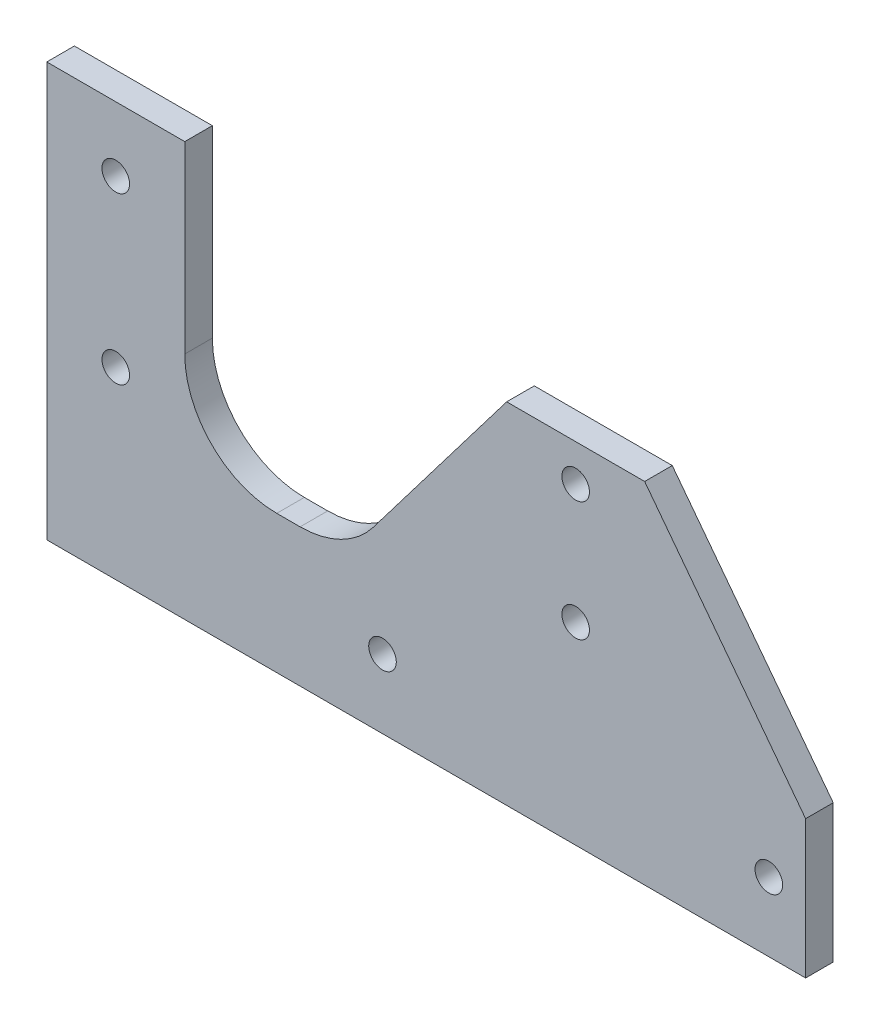
ISO-10303-21;
HEADER;
FILE_DESCRIPTION(('STEP AP214'),'2;1');
FILE_NAME('part.step','',(''),(''),'','','');
FILE_SCHEMA(('AUTOMOTIVE_DESIGN { 1 0 10303 214 1 1 1 1 }'));
ENDSEC;
DATA;
#1=APPLICATION_CONTEXT('core data for automotive mechanical design processes');
#2=APPLICATION_PROTOCOL_DEFINITION('international standard','automotive_design',2000,#1);
#3=PRODUCT_CONTEXT('',#1,'mechanical');
#4=PRODUCT('Part','Part','',(#3));
#5=PRODUCT_RELATED_PRODUCT_CATEGORY('part','',(#4));
#6=PRODUCT_DEFINITION_FORMATION('','',#4);
#7=PRODUCT_DEFINITION_CONTEXT('part definition',#1,'design');
#8=PRODUCT_DEFINITION('design','',#6,#7);
#9=PRODUCT_DEFINITION_SHAPE('','',#8);
#10=(LENGTH_UNIT() NAMED_UNIT(*) SI_UNIT(.MILLI.,.METRE.));
#11=(NAMED_UNIT(*) PLANE_ANGLE_UNIT() SI_UNIT($,.RADIAN.));
#12=(NAMED_UNIT(*) SI_UNIT($,.STERADIAN.) SOLID_ANGLE_UNIT());
#13=UNCERTAINTY_MEASURE_WITH_UNIT(LENGTH_MEASURE(1.E-05),#10,'distance_accuracy_value','');
#14=(GEOMETRIC_REPRESENTATION_CONTEXT(3) GLOBAL_UNCERTAINTY_ASSIGNED_CONTEXT((#13)) GLOBAL_UNIT_ASSIGNED_CONTEXT((#10,
#11,#12)) REPRESENTATION_CONTEXT('',''));
#15=CARTESIAN_POINT('',(0.,0.,0.));
#16=DIRECTION('',(0.,0.,1.));
#17=DIRECTION('',(1.,0.,0.));
#18=AXIS2_PLACEMENT_3D('',#15,#16,#17);
#19=CARTESIAN_POINT('',(-57.5,6.99999999999999,3.));
#20=DIRECTION('',(1.,0.,0.));
#21=DIRECTION('',(0.,1.,0.));
#22=AXIS2_PLACEMENT_3D('',#19,#20,#21);
#23=PLANE('',#22);
#24=DIRECTION('',(0.,-1.,0.));
#25=VECTOR('',#24,1.);
#26=CARTESIAN_POINT('',(-57.5,6.99999999999999,0.));
#27=LINE('',#26,#25);
#28=CARTESIAN_POINT('',(-57.5,6.99999999999999,0.));
#29=VERTEX_POINT('',#28);
#30=CARTESIAN_POINT('',(-57.5,-38.,0.));
#31=VERTEX_POINT('',#30);
#32=EDGE_CURVE('E151',#29,#31,#27,.T.);
#33=ORIENTED_EDGE('',*,*,#32,.T.);
#34=DIRECTION('',(0.,0.,-1.));
#35=VECTOR('',#34,1.);
#36=CARTESIAN_POINT('',(-57.5,-38.,3.));
#37=LINE('',#36,#35);
#38=CARTESIAN_POINT('',(-57.5,-38.,3.));
#39=VERTEX_POINT('',#38);
#40=EDGE_CURVE('E11',#39,#31,#37,.T.);
#41=ORIENTED_EDGE('',*,*,#40,.F.);
#42=DIRECTION('',(0.,-1.,0.));
#43=VECTOR('',#42,1.);
#44=CARTESIAN_POINT('',(-57.5,6.99999999999999,3.));
#45=LINE('',#44,#43);
#46=CARTESIAN_POINT('',(-57.5,6.99999999999999,3.));
#47=VERTEX_POINT('',#46);
#48=EDGE_CURVE('E172',#47,#39,#45,.T.);
#49=ORIENTED_EDGE('',*,*,#48,.F.);
#50=DIRECTION('',(0.,0.,-1.));
#51=VECTOR('',#50,1.);
#52=CARTESIAN_POINT('',(-57.5,6.99999999999999,3.));
#53=LINE('',#52,#51);
#54=EDGE_CURVE('E147',#47,#29,#53,.T.);
#55=ORIENTED_EDGE('',*,*,#54,.T.);
#56=EDGE_LOOP('',(#33,#41,#49,#55));
#57=FACE_BOUND('',#56,.T.);
#58=ADVANCED_FACE('F37',(#57),#23,.F.);
#59=CARTESIAN_POINT('',(25.,-38.,3.));
#60=DIRECTION('',(0.,1.,0.));
#61=DIRECTION('',(0.,0.,1.));
#62=AXIS2_PLACEMENT_3D('',#59,#60,#61);
#63=PLANE('',#62);
#64=DIRECTION('',(1.,0.,0.));
#65=VECTOR('',#64,1.);
#66=CARTESIAN_POINT('',(25.,-38.,0.));
#67=LINE('',#66,#65);
#68=CARTESIAN_POINT('',(25.,-38.,0.));
#69=VERTEX_POINT('',#68);
#70=EDGE_CURVE('E154',#31,#69,#67,.T.);
#71=ORIENTED_EDGE('',*,*,#70,.T.);
#72=DIRECTION('',(0.,0.,-1.));
#73=VECTOR('',#72,1.);
#74=CARTESIAN_POINT('',(25.,-38.,3.));
#75=LINE('',#74,#73);
#76=CARTESIAN_POINT('',(25.,-38.,3.));
#77=VERTEX_POINT('',#76);
#78=EDGE_CURVE('E45',#77,#69,#75,.T.);
#79=ORIENTED_EDGE('',*,*,#78,.F.);
#80=DIRECTION('',(1.,0.,0.));
#81=VECTOR('',#80,1.);
#82=CARTESIAN_POINT('',(-57.5,-38.,3.));
#83=LINE('',#82,#81);
#84=EDGE_CURVE('E105',#39,#77,#83,.T.);
#85=ORIENTED_EDGE('',*,*,#84,.F.);
#86=ORIENTED_EDGE('',*,*,#40,.T.);
#87=EDGE_LOOP('',(#71,#79,#85,#86));
#88=FACE_BOUND('',#87,.T.);
#89=ADVANCED_FACE('F245',(#88),#63,.F.);
#90=CARTESIAN_POINT('',(25.,-23.,3.));
#91=DIRECTION('',(-1.,0.,0.));
#92=DIRECTION('',(0.,0.,1.));
#93=AXIS2_PLACEMENT_3D('',#90,#91,#92);
#94=PLANE('',#93);
#95=DIRECTION('',(0.,1.,0.));
#96=VECTOR('',#95,1.);
#97=CARTESIAN_POINT('',(25.,-23.,0.));
#98=LINE('',#97,#96);
#99=CARTESIAN_POINT('',(25.,-23.,0.));
#100=VERTEX_POINT('',#99);
#101=EDGE_CURVE('E157',#69,#100,#98,.T.);
#102=ORIENTED_EDGE('',*,*,#101,.T.);
#103=DIRECTION('',(0.,0.,-1.));
#104=VECTOR('',#103,1.);
#105=CARTESIAN_POINT('',(25.,-23.,3.));
#106=LINE('',#105,#104);
#107=CARTESIAN_POINT('',(25.,-23.,3.));
#108=VERTEX_POINT('',#107);
#109=EDGE_CURVE('E188',#108,#100,#106,.T.);
#110=ORIENTED_EDGE('',*,*,#109,.F.);
#111=DIRECTION('',(0.,1.,0.));
#112=VECTOR('',#111,1.);
#113=CARTESIAN_POINT('',(25.,-23.,3.));
#114=LINE('',#113,#112);
#115=EDGE_CURVE('E196',#77,#108,#114,.T.);
#116=ORIENTED_EDGE('',*,*,#115,.F.);
#117=ORIENTED_EDGE('',*,*,#78,.T.);
#118=EDGE_LOOP('',(#102,#110,#116,#117));
#119=FACE_BOUND('',#118,.T.);
#120=ADVANCED_FACE('F194',(#119),#94,.F.);
#121=CARTESIAN_POINT('',(7.5,0.,3.));
#122=DIRECTION('',(-0.795828694120859,-0.605521832483262,0.));
#123=DIRECTION('',(0.605521832483262,-0.795828694120859,0.));
#124=AXIS2_PLACEMENT_3D('',#121,#122,#123);
#125=PLANE('',#124);
#126=DIRECTION('',(-0.605521832483262,0.795828694120859,0.));
#127=VECTOR('',#126,1.);
#128=CARTESIAN_POINT('',(7.5,0.,0.));
#129=LINE('',#128,#127);
#130=CARTESIAN_POINT('',(7.5,0.,0.));
#131=VERTEX_POINT('',#130);
#132=EDGE_CURVE('E159',#100,#131,#129,.T.);
#133=ORIENTED_EDGE('',*,*,#132,.T.);
#134=DIRECTION('',(0.,0.,-1.));
#135=VECTOR('',#134,1.);
#136=CARTESIAN_POINT('',(7.5,0.,3.));
#137=LINE('',#136,#135);
#138=CARTESIAN_POINT('',(7.5,0.,3.));
#139=VERTEX_POINT('',#138);
#140=EDGE_CURVE('E185',#139,#131,#137,.T.);
#141=ORIENTED_EDGE('',*,*,#140,.F.);
#142=DIRECTION('',(-0.605521832483262,0.795828694120859,0.));
#143=VECTOR('',#142,1.);
#144=CARTESIAN_POINT('',(7.5,0.,3.));
#145=LINE('',#144,#143);
#146=EDGE_CURVE('E214',#108,#139,#145,.T.);
#147=ORIENTED_EDGE('',*,*,#146,.F.);
#148=ORIENTED_EDGE('',*,*,#109,.T.);
#149=EDGE_LOOP('',(#133,#141,#147,#148));
#150=FACE_BOUND('',#149,.T.);
#151=ADVANCED_FACE('F205',(#150),#125,.F.);
#152=CARTESIAN_POINT('',(-7.5,0.,3.));
#153=DIRECTION('',(0.,-1.,0.));
#154=DIRECTION('',(0.,0.,-1.));
#155=AXIS2_PLACEMENT_3D('',#152,#153,#154);
#156=PLANE('',#155);
#157=DIRECTION('',(-1.,0.,0.));
#158=VECTOR('',#157,1.);
#159=CARTESIAN_POINT('',(-7.5,0.,0.));
#160=LINE('',#159,#158);
#161=CARTESIAN_POINT('',(-7.5,0.,0.));
#162=VERTEX_POINT('',#161);
#163=EDGE_CURVE('E161',#131,#162,#160,.T.);
#164=ORIENTED_EDGE('',*,*,#163,.T.);
#165=DIRECTION('',(0.,0.,-1.));
#166=VECTOR('',#165,1.);
#167=CARTESIAN_POINT('',(-7.5,0.,3.));
#168=LINE('',#167,#166);
#169=CARTESIAN_POINT('',(-7.5,0.,3.));
#170=VERTEX_POINT('',#169);
#171=EDGE_CURVE('E182',#170,#162,#168,.T.);
#172=ORIENTED_EDGE('',*,*,#171,.F.);
#173=DIRECTION('',(-1.,0.,0.));
#174=VECTOR('',#173,1.);
#175=CARTESIAN_POINT('',(-7.5,0.,3.));
#176=LINE('',#175,#174);
#177=EDGE_CURVE('E211',#139,#170,#176,.T.);
#178=ORIENTED_EDGE('',*,*,#177,.F.);
#179=ORIENTED_EDGE('',*,*,#140,.T.);
#180=EDGE_LOOP('',(#164,#172,#178,#179));
#181=FACE_BOUND('',#180,.T.);
#182=ADVANCED_FACE('F209',(#181),#156,.F.);
#183=CARTESIAN_POINT('',(-7.5,0.,3.));
#184=DIRECTION('',(0.795828694120859,-0.605521832483262,0.));
#185=DIRECTION('',(0.605521832483262,0.795828694120859,0.));
#186=AXIS2_PLACEMENT_3D('',#183,#184,#185);
#187=PLANE('',#186);
#188=DIRECTION('',(-0.605521832483262,-0.795828694120859,0.));
#189=VECTOR('',#188,1.);
#190=CARTESIAN_POINT('',(-7.5,0.,0.));
#191=LINE('',#190,#189);
#192=CARTESIAN_POINT('',(-21.9985356819378,-19.0552183248326,0.));
#193=VERTEX_POINT('',#192);
#194=EDGE_CURVE('E163',#162,#193,#191,.T.);
#195=ORIENTED_EDGE('',*,*,#194,.T.);
#196=DIRECTION('',(0.,0.,-1.));
#197=VECTOR('',#196,1.);
#198=CARTESIAN_POINT('',(-21.9985356819378,-19.0552183248326,3.));
#199=LINE('',#198,#197);
#200=CARTESIAN_POINT('',(-21.9985356819378,-19.0552183248326,3.));
#201=VERTEX_POINT('',#200);
#202=EDGE_CURVE('E179',#201,#193,#199,.T.);
#203=ORIENTED_EDGE('',*,*,#202,.F.);
#204=DIRECTION('',(-0.605521832483262,-0.795828694120859,0.));
#205=VECTOR('',#204,1.);
#206=CARTESIAN_POINT('',(-7.5,0.,3.));
#207=LINE('',#206,#205);
#208=EDGE_CURVE('E213',#170,#201,#207,.T.);
#209=ORIENTED_EDGE('',*,*,#208,.F.);
#210=ORIENTED_EDGE('',*,*,#171,.T.);
#211=EDGE_LOOP('',(#195,#203,#209,#210));
#212=FACE_BOUND('',#211,.T.);
#213=ADVANCED_FACE('F258',(#212),#187,.F.);
#214=CARTESIAN_POINT('',(-29.9568226231465,-13.,3.));
#215=DIRECTION('',(0.,0.,-1.));
#216=DIRECTION('',(-1.,0.,0.));
#217=AXIS2_PLACEMENT_3D('',#214,#215,#216);
#218=CYLINDRICAL_SURFACE('',#217,10.);
#219=CARTESIAN_POINT('',(-29.9568226231465,-13.,0.));
#220=DIRECTION('',(0.,0.,-1.));
#221=DIRECTION('',(1.,0.,0.));
#222=AXIS2_PLACEMENT_3D('',#219,#220,#221);
#223=CIRCLE('',#222,10.);
#224=CARTESIAN_POINT('',(-29.9568226231465,-23.,0.));
#225=VERTEX_POINT('',#224);
#226=EDGE_CURVE('E165',#193,#225,#223,.T.);
#227=ORIENTED_EDGE('',*,*,#226,.T.);
#228=DIRECTION('',(0.,0.,-1.));
#229=VECTOR('',#228,1.);
#230=CARTESIAN_POINT('',(-29.9568226231465,-23.,3.));
#231=LINE('',#230,#229);
#232=CARTESIAN_POINT('',(-29.9568226231465,-23.,3.));
#233=VERTEX_POINT('',#232);
#234=EDGE_CURVE('E176',#233,#225,#231,.T.);
#235=ORIENTED_EDGE('',*,*,#234,.F.);
#236=CARTESIAN_POINT('',(-29.9568226231465,-13.,3.));
#237=DIRECTION('',(0.,0.,-1.));
#238=DIRECTION('',(1.,0.,0.));
#239=AXIS2_PLACEMENT_3D('',#236,#237,#238);
#240=CIRCLE('',#239,10.);
#241=EDGE_CURVE('E216',#201,#233,#240,.T.);
#242=ORIENTED_EDGE('',*,*,#241,.F.);
#243=ORIENTED_EDGE('',*,*,#202,.T.);
#244=EDGE_LOOP('',(#227,#235,#242,#243));
#245=FACE_BOUND('',#244,.T.);
#246=ADVANCED_FACE('F225',(#245),#218,.F.);
#247=CARTESIAN_POINT('',(-29.9568226231465,-23.,3.));
#248=DIRECTION('',(0.,-1.,0.));
#249=DIRECTION('',(0.,0.,-1.));
#250=AXIS2_PLACEMENT_3D('',#247,#248,#249);
#251=PLANE('',#250);
#252=DIRECTION('',(-1.,0.,0.));
#253=VECTOR('',#252,1.);
#254=CARTESIAN_POINT('',(-29.9568226231465,-23.,0.));
#255=LINE('',#254,#253);
#256=CARTESIAN_POINT('',(-32.4999999999999,-23.,0.));
#257=VERTEX_POINT('',#256);
#258=EDGE_CURVE('E167',#225,#257,#255,.T.);
#259=ORIENTED_EDGE('',*,*,#258,.T.);
#260=DIRECTION('',(0.,0.,-1.));
#261=VECTOR('',#260,1.);
#262=CARTESIAN_POINT('',(-32.4999999999999,-23.,3.));
#263=LINE('',#262,#261);
#264=CARTESIAN_POINT('',(-32.4999999999999,-23.,3.));
#265=VERTEX_POINT('',#264);
#266=EDGE_CURVE('E142',#265,#257,#263,.T.);
#267=ORIENTED_EDGE('',*,*,#266,.F.);
#268=DIRECTION('',(-1.,0.,0.));
#269=VECTOR('',#268,1.);
#270=CARTESIAN_POINT('',(-29.9568226231465,-23.,3.));
#271=LINE('',#270,#269);
#272=EDGE_CURVE('E133',#233,#265,#271,.T.);
#273=ORIENTED_EDGE('',*,*,#272,.F.);
#274=ORIENTED_EDGE('',*,*,#234,.T.);
#275=EDGE_LOOP('',(#259,#267,#273,#274));
#276=FACE_BOUND('',#275,.T.);
#277=ADVANCED_FACE('F229',(#276),#251,.F.);
#278=CARTESIAN_POINT('',(-32.5,-13.,3.));
#279=DIRECTION('',(0.,0.,-1.));
#280=DIRECTION('',(-1.,0.,0.));
#281=AXIS2_PLACEMENT_3D('',#278,#279,#280);
#282=CYLINDRICAL_SURFACE('',#281,10.);
#283=CARTESIAN_POINT('',(-32.5,-13.,0.));
#284=DIRECTION('',(0.,0.,-1.));
#285=DIRECTION('',(-1.,0.,0.));
#286=AXIS2_PLACEMENT_3D('',#283,#284,#285);
#287=CIRCLE('',#286,10.);
#288=CARTESIAN_POINT('',(-42.5,-12.9999999999999,0.));
#289=VERTEX_POINT('',#288);
#290=EDGE_CURVE('E141',#257,#289,#287,.T.);
#291=ORIENTED_EDGE('',*,*,#290,.T.);
#292=DIRECTION('',(0.,0.,-1.));
#293=VECTOR('',#292,1.);
#294=CARTESIAN_POINT('',(-42.5,-12.9999999999999,3.));
#295=LINE('',#294,#293);
#296=CARTESIAN_POINT('',(-42.5,-12.9999999999999,3.));
#297=VERTEX_POINT('',#296);
#298=EDGE_CURVE('E138',#297,#289,#295,.T.);
#299=ORIENTED_EDGE('',*,*,#298,.F.);
#300=CARTESIAN_POINT('',(-32.5,-13.,3.));
#301=DIRECTION('',(0.,0.,-1.));
#302=DIRECTION('',(-1.,0.,0.));
#303=AXIS2_PLACEMENT_3D('',#300,#301,#302);
#304=CIRCLE('',#303,10.);
#305=EDGE_CURVE('E127',#265,#297,#304,.T.);
#306=ORIENTED_EDGE('',*,*,#305,.F.);
#307=ORIENTED_EDGE('',*,*,#266,.T.);
#308=EDGE_LOOP('',(#291,#299,#306,#307));
#309=FACE_BOUND('',#308,.T.);
#310=ADVANCED_FACE('F139',(#309),#282,.F.);
#311=CARTESIAN_POINT('',(-42.5,-12.9999999999999,3.));
#312=DIRECTION('',(-1.,0.,0.));
#313=DIRECTION('',(0.,0.,1.));
#314=AXIS2_PLACEMENT_3D('',#311,#312,#313);
#315=PLANE('',#314);
#316=DIRECTION('',(0.,1.,0.));
#317=VECTOR('',#316,1.);
#318=CARTESIAN_POINT('',(-42.5,-12.9999999999999,0.));
#319=LINE('',#318,#317);
#320=CARTESIAN_POINT('',(-42.5,6.99999999999999,0.));
#321=VERTEX_POINT('',#320);
#322=EDGE_CURVE('E91',#289,#321,#319,.T.);
#323=ORIENTED_EDGE('',*,*,#322,.T.);
#324=DIRECTION('',(0.,0.,-1.));
#325=VECTOR('',#324,1.);
#326=CARTESIAN_POINT('',(-42.5,6.99999999999999,3.));
#327=LINE('',#326,#325);
#328=CARTESIAN_POINT('',(-42.5,6.99999999999999,3.));
#329=VERTEX_POINT('',#328);
#330=EDGE_CURVE('E143',#329,#321,#327,.T.);
#331=ORIENTED_EDGE('',*,*,#330,.F.);
#332=DIRECTION('',(0.,1.,0.));
#333=VECTOR('',#332,1.);
#334=CARTESIAN_POINT('',(-42.5,-12.9999999999999,3.));
#335=LINE('',#334,#333);
#336=EDGE_CURVE('E131',#297,#329,#335,.T.);
#337=ORIENTED_EDGE('',*,*,#336,.F.);
#338=ORIENTED_EDGE('',*,*,#298,.T.);
#339=EDGE_LOOP('',(#323,#331,#337,#338));
#340=FACE_BOUND('',#339,.T.);
#341=ADVANCED_FACE('F145',(#340),#315,.F.);
#342=CARTESIAN_POINT('',(-42.5,6.99999999999999,3.));
#343=DIRECTION('',(0.,-1.,0.));
#344=DIRECTION('',(1.,0.,0.));
#345=AXIS2_PLACEMENT_3D('',#342,#343,#344);
#346=PLANE('',#345);
#347=DIRECTION('',(-1.,0.,0.));
#348=VECTOR('',#347,1.);
#349=CARTESIAN_POINT('',(-42.5,6.99999999999999,0.));
#350=LINE('',#349,#348);
#351=EDGE_CURVE('E97',#321,#29,#350,.T.);
#352=ORIENTED_EDGE('',*,*,#351,.T.);
#353=ORIENTED_EDGE('',*,*,#54,.F.);
#354=DIRECTION('',(-1.,0.,0.));
#355=VECTOR('',#354,1.);
#356=CARTESIAN_POINT('',(-42.5,6.99999999999999,3.));
#357=LINE('',#356,#355);
#358=EDGE_CURVE('E53',#329,#47,#357,.T.);
#359=ORIENTED_EDGE('',*,*,#358,.F.);
#360=ORIENTED_EDGE('',*,*,#330,.T.);
#361=EDGE_LOOP('',(#352,#353,#359,#360));
#362=FACE_BOUND('',#361,.T.);
#363=ADVANCED_FACE('F233',(#362),#346,.F.);
#364=CARTESIAN_POINT('',(-29.9568226231465,-13.,3.));
#365=DIRECTION('',(0.,0.,1.));
#366=DIRECTION('',(1.,0.,0.));
#367=AXIS2_PLACEMENT_3D('',#364,#365,#366);
#368=PLANE('',#367);
#369=CARTESIAN_POINT('',(-50.,0.,3.));
#370=DIRECTION('',(0.,0.,1.));
#371=DIRECTION('',(1.,0.,0.));
#372=AXIS2_PLACEMENT_3D('',#369,#370,#371);
#373=CIRCLE('',#372,1.5);
#374=CARTESIAN_POINT('',(-48.5,0.,3.));
#375=VERTEX_POINT('',#374);
#376=EDGE_CURVE('E363',#375,#375,#373,.T.);
#377=ORIENTED_EDGE('',*,*,#376,.F.);
#378=EDGE_LOOP('',(#377));
#379=FACE_BOUND('',#378,.T.);
#380=CARTESIAN_POINT('',(21.,-30.5,3.));
#381=DIRECTION('',(0.,0.,1.));
#382=DIRECTION('',(1.,0.,0.));
#383=AXIS2_PLACEMENT_3D('',#380,#381,#382);
#384=CIRCLE('',#383,1.5);
#385=CARTESIAN_POINT('',(22.5,-30.5,3.));
#386=VERTEX_POINT('',#385);
#387=EDGE_CURVE('E366',#386,#386,#384,.T.);
#388=ORIENTED_EDGE('',*,*,#387,.F.);
#389=EDGE_LOOP('',(#388));
#390=FACE_BOUND('',#389,.T.);
#391=CARTESIAN_POINT('',(-21.,-30.5,3.));
#392=DIRECTION('',(0.,0.,1.));
#393=DIRECTION('',(1.,0.,0.));
#394=AXIS2_PLACEMENT_3D('',#391,#392,#393);
#395=CIRCLE('',#394,1.5);
#396=CARTESIAN_POINT('',(-19.5,-30.5,3.));
#397=VERTEX_POINT('',#396);
#398=EDGE_CURVE('E383',#397,#397,#395,.T.);
#399=ORIENTED_EDGE('',*,*,#398,.F.);
#400=EDGE_LOOP('',(#399));
#401=FACE_BOUND('',#400,.T.);
#402=CARTESIAN_POINT('',(0.,-17.,3.));
#403=DIRECTION('',(0.,0.,1.));
#404=DIRECTION('',(1.,0.,0.));
#405=AXIS2_PLACEMENT_3D('',#402,#403,#404);
#406=CIRCLE('',#405,1.5);
#407=CARTESIAN_POINT('',(1.5,-17.,3.));
#408=VERTEX_POINT('',#407);
#409=EDGE_CURVE('E377',#408,#408,#406,.T.);
#410=ORIENTED_EDGE('',*,*,#409,.F.);
#411=EDGE_LOOP('',(#410));
#412=FACE_BOUND('',#411,.T.);
#413=CARTESIAN_POINT('',(-50.,-18.,3.));
#414=DIRECTION('',(0.,0.,1.));
#415=DIRECTION('',(1.,0.,0.));
#416=AXIS2_PLACEMENT_3D('',#413,#414,#415);
#417=CIRCLE('',#416,1.5);
#418=CARTESIAN_POINT('',(-48.5,-18.,3.));
#419=VERTEX_POINT('',#418);
#420=EDGE_CURVE('E369',#419,#419,#417,.T.);
#421=ORIENTED_EDGE('',*,*,#420,.F.);
#422=EDGE_LOOP('',(#421));
#423=FACE_BOUND('',#422,.T.);
#424=CARTESIAN_POINT('',(0.,-4.,3.));
#425=DIRECTION('',(0.,0.,1.));
#426=DIRECTION('',(1.,0.,0.));
#427=AXIS2_PLACEMENT_3D('',#424,#425,#426);
#428=CIRCLE('',#427,1.5);
#429=CARTESIAN_POINT('',(1.5,-4.,3.));
#430=VERTEX_POINT('',#429);
#431=EDGE_CURVE('E376',#430,#430,#428,.T.);
#432=ORIENTED_EDGE('',*,*,#431,.F.);
#433=EDGE_LOOP('',(#432));
#434=FACE_BOUND('',#433,.T.);
#435=ORIENTED_EDGE('',*,*,#48,.T.);
#436=ORIENTED_EDGE('',*,*,#84,.T.);
#437=ORIENTED_EDGE('',*,*,#115,.T.);
#438=ORIENTED_EDGE('',*,*,#146,.T.);
#439=ORIENTED_EDGE('',*,*,#177,.T.);
#440=ORIENTED_EDGE('',*,*,#208,.T.);
#441=ORIENTED_EDGE('',*,*,#241,.T.);
#442=ORIENTED_EDGE('',*,*,#272,.T.);
#443=ORIENTED_EDGE('',*,*,#305,.T.);
#444=ORIENTED_EDGE('',*,*,#336,.T.);
#445=ORIENTED_EDGE('',*,*,#358,.T.);
#446=EDGE_LOOP('',(#435,#436,#437,#438,#439,#440,#441,#442,#443,#444,#445));
#447=FACE_BOUND('',#446,.T.);
#448=ADVANCED_FACE('F129',(#379,#390,#401,#412,#423,#434,#447),#368,.T.);
#449=CARTESIAN_POINT('',(-29.9568226231465,-13.,0.));
#450=DIRECTION('',(0.,0.,1.));
#451=DIRECTION('',(1.,0.,0.));
#452=AXIS2_PLACEMENT_3D('',#449,#450,#451);
#453=PLANE('',#452);
#454=CARTESIAN_POINT('',(-50.,0.,0.));
#455=DIRECTION('',(0.,0.,1.));
#456=DIRECTION('',(1.,0.,0.));
#457=AXIS2_PLACEMENT_3D('',#454,#455,#456);
#458=CIRCLE('',#457,1.5);
#459=CARTESIAN_POINT('',(-48.5,0.,0.));
#460=VERTEX_POINT('',#459);
#461=EDGE_CURVE('E360',#460,#460,#458,.T.);
#462=ORIENTED_EDGE('',*,*,#461,.T.);
#463=EDGE_LOOP('',(#462));
#464=FACE_BOUND('',#463,.T.);
#465=CARTESIAN_POINT('',(21.,-30.5,0.));
#466=DIRECTION('',(0.,0.,1.));
#467=DIRECTION('',(1.,0.,0.));
#468=AXIS2_PLACEMENT_3D('',#465,#466,#467);
#469=CIRCLE('',#468,1.5);
#470=CARTESIAN_POINT('',(22.5,-30.5,0.));
#471=VERTEX_POINT('',#470);
#472=EDGE_CURVE('E386',#471,#471,#469,.T.);
#473=ORIENTED_EDGE('',*,*,#472,.T.);
#474=EDGE_LOOP('',(#473));
#475=FACE_BOUND('',#474,.T.);
#476=CARTESIAN_POINT('',(-21.,-30.5,0.));
#477=DIRECTION('',(0.,0.,1.));
#478=DIRECTION('',(1.,0.,0.));
#479=AXIS2_PLACEMENT_3D('',#476,#477,#478);
#480=CIRCLE('',#479,1.5);
#481=CARTESIAN_POINT('',(-19.5,-30.5,0.));
#482=VERTEX_POINT('',#481);
#483=EDGE_CURVE('E380',#482,#482,#480,.T.);
#484=ORIENTED_EDGE('',*,*,#483,.T.);
#485=EDGE_LOOP('',(#484));
#486=FACE_BOUND('',#485,.T.);
#487=CARTESIAN_POINT('',(0.,-17.,0.));
#488=DIRECTION('',(0.,0.,1.));
#489=DIRECTION('',(1.,0.,0.));
#490=AXIS2_PLACEMENT_3D('',#487,#488,#489);
#491=CIRCLE('',#490,1.5);
#492=CARTESIAN_POINT('',(1.5,-17.,0.));
#493=VERTEX_POINT('',#492);
#494=EDGE_CURVE('E373',#493,#493,#491,.T.);
#495=ORIENTED_EDGE('',*,*,#494,.T.);
#496=EDGE_LOOP('',(#495));
#497=FACE_BOUND('',#496,.T.);
#498=CARTESIAN_POINT('',(-50.,-18.,0.));
#499=DIRECTION('',(0.,0.,1.));
#500=DIRECTION('',(1.,0.,0.));
#501=AXIS2_PLACEMENT_3D('',#498,#499,#500);
#502=CIRCLE('',#501,1.5);
#503=CARTESIAN_POINT('',(-48.5,-18.,0.));
#504=VERTEX_POINT('',#503);
#505=EDGE_CURVE('E364',#504,#504,#502,.T.);
#506=ORIENTED_EDGE('',*,*,#505,.T.);
#507=EDGE_LOOP('',(#506));
#508=FACE_BOUND('',#507,.T.);
#509=CARTESIAN_POINT('',(0.,-4.,0.));
#510=DIRECTION('',(0.,0.,1.));
#511=DIRECTION('',(1.,0.,0.));
#512=AXIS2_PLACEMENT_3D('',#509,#510,#511);
#513=CIRCLE('',#512,1.5);
#514=CARTESIAN_POINT('',(1.5,-4.,0.));
#515=VERTEX_POINT('',#514);
#516=EDGE_CURVE('E155',#515,#515,#513,.T.);
#517=ORIENTED_EDGE('',*,*,#516,.T.);
#518=EDGE_LOOP('',(#517));
#519=FACE_BOUND('',#518,.T.);
#520=ORIENTED_EDGE('',*,*,#32,.F.);
#521=ORIENTED_EDGE('',*,*,#351,.F.);
#522=ORIENTED_EDGE('',*,*,#322,.F.);
#523=ORIENTED_EDGE('',*,*,#290,.F.);
#524=ORIENTED_EDGE('',*,*,#258,.F.);
#525=ORIENTED_EDGE('',*,*,#226,.F.);
#526=ORIENTED_EDGE('',*,*,#194,.F.);
#527=ORIENTED_EDGE('',*,*,#163,.F.);
#528=ORIENTED_EDGE('',*,*,#132,.F.);
#529=ORIENTED_EDGE('',*,*,#101,.F.);
#530=ORIENTED_EDGE('',*,*,#70,.F.);
#531=EDGE_LOOP('',(#520,#521,#522,#523,#524,#525,#526,#527,#528,#529,#530));
#532=FACE_BOUND('',#531,.T.);
#533=ADVANCED_FACE('F200',(#464,#475,#486,#497,#508,#519,#532),#453,.F.);
#534=CARTESIAN_POINT('',(0.,-4.,0.));
#535=DIRECTION('',(0.,0.,1.));
#536=DIRECTION('',(1.,0.,0.));
#537=AXIS2_PLACEMENT_3D('',#534,#535,#536);
#538=CYLINDRICAL_SURFACE('',#537,1.5);
#539=ORIENTED_EDGE('',*,*,#516,.F.);
#540=EDGE_LOOP('',(#539));
#541=FACE_BOUND('',#540,.T.);
#542=ORIENTED_EDGE('',*,*,#431,.T.);
#543=EDGE_LOOP('',(#542));
#544=FACE_BOUND('',#543,.T.);
#545=ADVANCED_FACE('F294',(#541,#544),#538,.F.);
#546=CARTESIAN_POINT('',(-50.,-18.,0.));
#547=DIRECTION('',(0.,0.,1.));
#548=DIRECTION('',(1.,0.,0.));
#549=AXIS2_PLACEMENT_3D('',#546,#547,#548);
#550=CYLINDRICAL_SURFACE('',#549,1.5);
#551=ORIENTED_EDGE('',*,*,#505,.F.);
#552=EDGE_LOOP('',(#551));
#553=FACE_BOUND('',#552,.T.);
#554=ORIENTED_EDGE('',*,*,#420,.T.);
#555=EDGE_LOOP('',(#554));
#556=FACE_BOUND('',#555,.T.);
#557=ADVANCED_FACE('F303',(#553,#556),#550,.F.);
#558=CARTESIAN_POINT('',(0.,-17.,0.));
#559=DIRECTION('',(0.,0.,1.));
#560=DIRECTION('',(1.,0.,0.));
#561=AXIS2_PLACEMENT_3D('',#558,#559,#560);
#562=CYLINDRICAL_SURFACE('',#561,1.5);
#563=ORIENTED_EDGE('',*,*,#494,.F.);
#564=EDGE_LOOP('',(#563));
#565=FACE_BOUND('',#564,.T.);
#566=ORIENTED_EDGE('',*,*,#409,.T.);
#567=EDGE_LOOP('',(#566));
#568=FACE_BOUND('',#567,.T.);
#569=ADVANCED_FACE('F313',(#565,#568),#562,.F.);
#570=CARTESIAN_POINT('',(-21.,-30.5,0.));
#571=DIRECTION('',(0.,0.,1.));
#572=DIRECTION('',(1.,0.,0.));
#573=AXIS2_PLACEMENT_3D('',#570,#571,#572);
#574=CYLINDRICAL_SURFACE('',#573,1.5);
#575=ORIENTED_EDGE('',*,*,#483,.F.);
#576=EDGE_LOOP('',(#575));
#577=FACE_BOUND('',#576,.T.);
#578=ORIENTED_EDGE('',*,*,#398,.T.);
#579=EDGE_LOOP('',(#578));
#580=FACE_BOUND('',#579,.T.);
#581=ADVANCED_FACE('F323',(#577,#580),#574,.F.);
#582=CARTESIAN_POINT('',(21.,-30.5,0.));
#583=DIRECTION('',(0.,0.,1.));
#584=DIRECTION('',(1.,0.,0.));
#585=AXIS2_PLACEMENT_3D('',#582,#583,#584);
#586=CYLINDRICAL_SURFACE('',#585,1.5);
#587=ORIENTED_EDGE('',*,*,#472,.F.);
#588=EDGE_LOOP('',(#587));
#589=FACE_BOUND('',#588,.T.);
#590=ORIENTED_EDGE('',*,*,#387,.T.);
#591=EDGE_LOOP('',(#590));
#592=FACE_BOUND('',#591,.T.);
#593=ADVANCED_FACE('F333',(#589,#592),#586,.F.);
#594=CARTESIAN_POINT('',(-50.,0.,0.));
#595=DIRECTION('',(0.,0.,1.));
#596=DIRECTION('',(1.,0.,0.));
#597=AXIS2_PLACEMENT_3D('',#594,#595,#596);
#598=CYLINDRICAL_SURFACE('',#597,1.5);
#599=ORIENTED_EDGE('',*,*,#461,.F.);
#600=EDGE_LOOP('',(#599));
#601=FACE_BOUND('',#600,.T.);
#602=ORIENTED_EDGE('',*,*,#376,.T.);
#603=EDGE_LOOP('',(#602));
#604=FACE_BOUND('',#603,.T.);
#605=ADVANCED_FACE('F343',(#601,#604),#598,.F.);
#606=CLOSED_SHELL('',(#58,#89,#120,#151,#182,#213,#246,#277,#310,#341,#363,#448,#533,#545,#557,
#569,#581,#593,#605));
#607=MANIFOLD_SOLID_BREP('B2',#606);
#608=ADVANCED_BREP_SHAPE_REPRESENTATION('',(#18,#607),#14);
#609=SHAPE_DEFINITION_REPRESENTATION(#9,#608);
ENDSEC;
END-ISO-10303-21;
